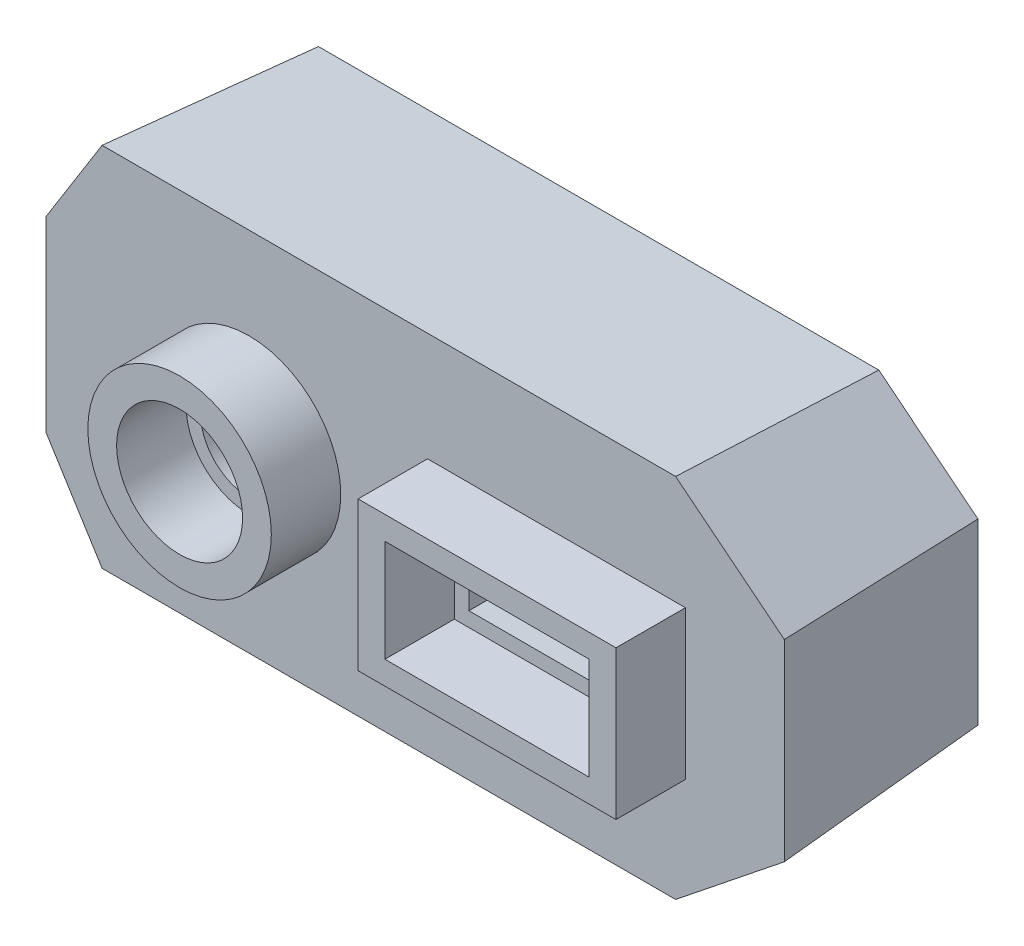
ISO-10303-21;
HEADER;
FILE_DESCRIPTION(('STEP AP214'),'2;1');
FILE_NAME('part.step','',(''),(''),'','','');
FILE_SCHEMA(('AUTOMOTIVE_DESIGN { 1 0 10303 214 1 1 1 1 }'));
ENDSEC;
DATA;
#1=APPLICATION_CONTEXT('core data for automotive mechanical design processes');
#2=APPLICATION_PROTOCOL_DEFINITION('international standard','automotive_design',2000,#1);
#3=PRODUCT_CONTEXT('',#1,'mechanical');
#4=PRODUCT('Part','Part','',(#3));
#5=PRODUCT_RELATED_PRODUCT_CATEGORY('part','',(#4));
#6=PRODUCT_DEFINITION_FORMATION('','',#4);
#7=PRODUCT_DEFINITION_CONTEXT('part definition',#1,'design');
#8=PRODUCT_DEFINITION('design','',#6,#7);
#9=PRODUCT_DEFINITION_SHAPE('','',#8);
#10=(LENGTH_UNIT() NAMED_UNIT(*) SI_UNIT(.MILLI.,.METRE.));
#11=(NAMED_UNIT(*) PLANE_ANGLE_UNIT() SI_UNIT($,.RADIAN.));
#12=(NAMED_UNIT(*) SI_UNIT($,.STERADIAN.) SOLID_ANGLE_UNIT());
#13=UNCERTAINTY_MEASURE_WITH_UNIT(LENGTH_MEASURE(1.E-05),#10,'distance_accuracy_value','');
#14=(GEOMETRIC_REPRESENTATION_CONTEXT(3) GLOBAL_UNCERTAINTY_ASSIGNED_CONTEXT((#13)) GLOBAL_UNIT_ASSIGNED_CONTEXT((#10,
#11,#12)) REPRESENTATION_CONTEXT('',''));
#15=CARTESIAN_POINT('',(0.,0.,0.));
#16=DIRECTION('',(0.,0.,1.));
#17=DIRECTION('',(1.,0.,0.));
#18=AXIS2_PLACEMENT_3D('',#15,#16,#17);
#19=CARTESIAN_POINT('',(0.,0.,42.));
#20=DIRECTION('',(0.,0.,-1.));
#21=DIRECTION('',(-1.,0.,0.));
#22=AXIS2_PLACEMENT_3D('',#19,#20,#21);
#23=PLANE('',#22);
#24=DIRECTION('',(0.52999894000318,0.847998304005088,0.));
#25=VECTOR('',#24,1.);
#26=CARTESIAN_POINT('',(-37.906238690247,23.6913991814044,42.));
#27=LINE('',#26,#25);
#28=CARTESIAN_POINT('',(-29.6277843651076,36.9369261016274,42.));
#29=VERTEX_POINT('',#28);
#30=CARTESIAN_POINT('',(-40.9369261016274,18.8422993231957,42.));
#31=VERTEX_POINT('',#30);
#32=EDGE_CURVE('E265',#29,#31,#27,.F.);
#33=ORIENTED_EDGE('',*,*,#32,.T.);
#34=DIRECTION('',(0.,1.,0.));
#35=VECTOR('',#34,1.);
#36=CARTESIAN_POINT('',(-40.9369261016274,0.,42.));
#37=LINE('',#36,#35);
#38=CARTESIAN_POINT('',(-40.9369261016274,-18.8422993231957,42.));
#39=VERTEX_POINT('',#38);
#40=EDGE_CURVE('E289',#31,#39,#37,.F.);
#41=ORIENTED_EDGE('',*,*,#40,.T.);
#42=DIRECTION('',(-0.52999894000318,0.847998304005088,0.));
#43=VECTOR('',#42,1.);
#44=CARTESIAN_POINT('',(-37.906238690247,-23.6913991814044,42.));
#45=LINE('',#44,#43);
#46=CARTESIAN_POINT('',(-29.6277843651076,-36.9369261016274,42.));
#47=VERTEX_POINT('',#46);
#48=EDGE_CURVE('E292',#39,#47,#45,.F.);
#49=ORIENTED_EDGE('',*,*,#48,.T.);
#50=DIRECTION('',(-1.,0.,0.));
#51=VECTOR('',#50,1.);
#52=CARTESIAN_POINT('',(0.,-36.9369261016274,42.));
#53=LINE('',#52,#51);
#54=CARTESIAN_POINT('',(86.0302180491857,-36.9369261016274,42.));
#55=VERTEX_POINT('',#54);
#56=EDGE_CURVE('E291',#47,#55,#53,.F.);
#57=ORIENTED_EDGE('',*,*,#56,.T.);
#58=DIRECTION('',(-0.78086880944303,-0.624695047554425,0.));
#59=VECTOR('',#58,1.);
#60=CARTESIAN_POINT('',(51.5907807516956,-64.4884759396195,42.));
#61=LINE('',#60,#59);
#62=CARTESIAN_POINT('',(107.936926101627,-19.411559659674,42.));
#63=VERTEX_POINT('',#62);
#64=EDGE_CURVE('E293',#55,#63,#61,.F.);
#65=ORIENTED_EDGE('',*,*,#64,.T.);
#66=DIRECTION('',(0.,-1.,0.));
#67=VECTOR('',#66,1.);
#68=CARTESIAN_POINT('',(107.936926101627,0.,42.));
#69=LINE('',#68,#67);
#70=CARTESIAN_POINT('',(107.936926101627,19.411559659674,42.));
#71=VERTEX_POINT('',#70);
#72=EDGE_CURVE('E300',#63,#71,#69,.F.);
#73=ORIENTED_EDGE('',*,*,#72,.T.);
#74=DIRECTION('',(0.78086880944303,-0.624695047554425,0.));
#75=VECTOR('',#74,1.);
#76=CARTESIAN_POINT('',(51.5907807516956,64.4884759396195,42.));
#77=LINE('',#76,#75);
#78=CARTESIAN_POINT('',(86.0302180491857,36.9369261016274,42.));
#79=VERTEX_POINT('',#78);
#80=EDGE_CURVE('E299',#71,#79,#77,.F.);
#81=ORIENTED_EDGE('',*,*,#80,.T.);
#82=DIRECTION('',(1.,0.,0.));
#83=VECTOR('',#82,1.);
#84=CARTESIAN_POINT('',(0.,36.9369261016274,42.));
#85=LINE('',#84,#83);
#86=EDGE_CURVE('E269',#79,#29,#85,.F.);
#87=ORIENTED_EDGE('',*,*,#86,.T.);
#88=EDGE_LOOP('',(#33,#41,#49,#57,#65,#73,#81,#87));
#89=FACE_BOUND('',#88,.T.);
#90=DIRECTION('',(0.,-1.,0.));
#91=VECTOR('',#90,1.);
#92=CARTESIAN_POINT('',(36.,0.,42.));
#93=LINE('',#92,#91);
#94=CARTESIAN_POINT('',(36.,15.,42.));
#95=VERTEX_POINT('',#94);
#96=CARTESIAN_POINT('',(36.,-15.,42.));
#97=VERTEX_POINT('',#96);
#98=EDGE_CURVE('E226',#95,#97,#93,.T.);
#99=ORIENTED_EDGE('',*,*,#98,.F.);
#100=DIRECTION('',(-1.,0.,0.));
#101=VECTOR('',#100,1.);
#102=CARTESIAN_POINT('',(0.,15.,42.));
#103=LINE('',#102,#101);
#104=CARTESIAN_POINT('',(88.,15.,42.));
#105=VERTEX_POINT('',#104);
#106=EDGE_CURVE('E221',#105,#95,#103,.T.);
#107=ORIENTED_EDGE('',*,*,#106,.F.);
#108=DIRECTION('',(0.,1.,0.));
#109=VECTOR('',#108,1.);
#110=CARTESIAN_POINT('',(88.,0.,42.));
#111=LINE('',#110,#109);
#112=CARTESIAN_POINT('',(88.,-15.,42.));
#113=VERTEX_POINT('',#112);
#114=EDGE_CURVE('E63',#113,#105,#111,.T.);
#115=ORIENTED_EDGE('',*,*,#114,.F.);
#116=DIRECTION('',(1.,0.,0.));
#117=VECTOR('',#116,1.);
#118=CARTESIAN_POINT('',(0.,-15.,42.));
#119=LINE('',#118,#117);
#120=EDGE_CURVE('E59',#97,#113,#119,.T.);
#121=ORIENTED_EDGE('',*,*,#120,.F.);
#122=EDGE_LOOP('',(#99,#107,#115,#121));
#123=FACE_BOUND('',#122,.T.);
#124=CARTESIAN_POINT('',(0.,0.,42.));
#125=DIRECTION('',(0.,0.,-1.));
#126=DIRECTION('',(-1.,0.,0.));
#127=AXIS2_PLACEMENT_3D('',#124,#125,#126);
#128=CIRCLE('',#127,18.5);
#129=CARTESIAN_POINT('',(-18.5,0.,42.));
#130=VERTEX_POINT('',#129);
#131=EDGE_CURVE('E11',#130,#130,#128,.F.);
#132=ORIENTED_EDGE('',*,*,#131,.F.);
#133=EDGE_LOOP('',(#132));
#134=FACE_BOUND('',#133,.T.);
#135=ADVANCED_FACE('F41',(#89,#123,#134),#23,.F.);
#136=CARTESIAN_POINT('',(0.,0.,42.));
#137=DIRECTION('',(0.,0.,-1.));
#138=DIRECTION('',(-1.,0.,0.));
#139=AXIS2_PLACEMENT_3D('',#136,#137,#138);
#140=CIRCLE('',#139,12.7);
#141=CARTESIAN_POINT('',(-12.7,0.,42.));
#142=VERTEX_POINT('',#141);
#143=EDGE_CURVE('E216',#142,#142,#140,.F.);
#144=ORIENTED_EDGE('',*,*,#143,.T.);
#145=EDGE_LOOP('',(#144));
#146=FACE_BOUND('',#145,.T.);
#147=CARTESIAN_POINT('',(0.,0.,42.));
#148=DIRECTION('',(0.,0.,-1.));
#149=DIRECTION('',(-1.,0.,0.));
#150=AXIS2_PLACEMENT_3D('',#147,#148,#149);
#151=CIRCLE('',#150,9.76307389837256);
#152=CARTESIAN_POINT('',(-9.76307389837256,0.,42.));
#153=VERTEX_POINT('',#152);
#154=EDGE_CURVE('E44',#153,#153,#151,.F.);
#155=ORIENTED_EDGE('',*,*,#154,.F.);
#156=EDGE_LOOP('',(#155));
#157=FACE_BOUND('',#156,.T.);
#158=ADVANCED_FACE('F353',(#146,#157),#23,.F.);
#159=DIRECTION('',(-1.,0.,0.));
#160=VECTOR('',#159,1.);
#161=CARTESIAN_POINT('',(0.,10.3,42.));
#162=LINE('',#161,#160);
#163=CARTESIAN_POINT('',(82.6,10.3,42.));
#164=VERTEX_POINT('',#163);
#165=CARTESIAN_POINT('',(41.4,10.3,42.));
#166=VERTEX_POINT('',#165);
#167=EDGE_CURVE('E182',#164,#166,#162,.T.);
#168=ORIENTED_EDGE('',*,*,#167,.T.);
#169=DIRECTION('',(0.,-1.,0.));
#170=VECTOR('',#169,1.);
#171=CARTESIAN_POINT('',(41.4,0.,42.));
#172=LINE('',#171,#170);
#173=CARTESIAN_POINT('',(41.4,-10.3,42.));
#174=VERTEX_POINT('',#173);
#175=EDGE_CURVE('E206',#166,#174,#172,.T.);
#176=ORIENTED_EDGE('',*,*,#175,.T.);
#177=DIRECTION('',(1.,0.,0.));
#178=VECTOR('',#177,1.);
#179=CARTESIAN_POINT('',(0.,-10.3,42.));
#180=LINE('',#179,#178);
#181=CARTESIAN_POINT('',(82.6,-10.3,42.));
#182=VERTEX_POINT('',#181);
#183=EDGE_CURVE('E214',#174,#182,#180,.T.);
#184=ORIENTED_EDGE('',*,*,#183,.T.);
#185=DIRECTION('',(0.,1.,0.));
#186=VECTOR('',#185,1.);
#187=CARTESIAN_POINT('',(82.6,0.,42.));
#188=LINE('',#187,#186);
#189=EDGE_CURVE('E208',#182,#164,#188,.T.);
#190=ORIENTED_EDGE('',*,*,#189,.T.);
#191=EDGE_LOOP('',(#168,#176,#184,#190));
#192=FACE_BOUND('',#191,.T.);
#193=DIRECTION('',(0.,-1.,0.));
#194=VECTOR('',#193,1.);
#195=CARTESIAN_POINT('',(44.3369261016274,0.,42.));
#196=LINE('',#195,#194);
#197=CARTESIAN_POINT('',(44.3369261016274,7.36307389837256,42.));
#198=VERTEX_POINT('',#197);
#199=CARTESIAN_POINT('',(44.3369261016274,-7.36307389837256,42.));
#200=VERTEX_POINT('',#199);
#201=EDGE_CURVE('E238',#198,#200,#196,.T.);
#202=ORIENTED_EDGE('',*,*,#201,.F.);
#203=DIRECTION('',(-1.,0.,0.));
#204=VECTOR('',#203,1.);
#205=CARTESIAN_POINT('',(0.,7.36307389837256,42.));
#206=LINE('',#205,#204);
#207=CARTESIAN_POINT('',(79.6630738983726,7.36307389837256,42.));
#208=VERTEX_POINT('',#207);
#209=EDGE_CURVE('E306',#208,#198,#206,.T.);
#210=ORIENTED_EDGE('',*,*,#209,.F.);
#211=DIRECTION('',(0.,1.,0.));
#212=VECTOR('',#211,1.);
#213=CARTESIAN_POINT('',(79.6630738983726,0.,42.));
#214=LINE('',#213,#212);
#215=CARTESIAN_POINT('',(79.6630738983726,-7.36307389837256,42.));
#216=VERTEX_POINT('',#215);
#217=EDGE_CURVE('E313',#216,#208,#214,.T.);
#218=ORIENTED_EDGE('',*,*,#217,.F.);
#219=DIRECTION('',(1.,0.,0.));
#220=VECTOR('',#219,1.);
#221=CARTESIAN_POINT('',(0.,-7.36307389837256,42.));
#222=LINE('',#221,#220);
#223=EDGE_CURVE('E316',#200,#216,#222,.T.);
#224=ORIENTED_EDGE('',*,*,#223,.F.);
#225=EDGE_LOOP('',(#202,#210,#218,#224));
#226=FACE_BOUND('',#225,.T.);
#227=ADVANCED_FACE('F326',(#192,#226),#23,.F.);
#228=CARTESIAN_POINT('',(0.,0.,0.));
#229=DIRECTION('',(0.,0.,-1.));
#230=DIRECTION('',(-1.,0.,0.));
#231=AXIS2_PLACEMENT_3D('',#228,#229,#230);
#232=PLANE('',#231);
#233=DIRECTION('',(-1.,0.,0.));
#234=VECTOR('',#233,1.);
#235=CARTESIAN_POINT('',(41.4,10.3,0.));
#236=LINE('',#235,#234);
#237=CARTESIAN_POINT('',(82.6,10.3,0.));
#238=VERTEX_POINT('',#237);
#239=CARTESIAN_POINT('',(41.4,10.3,0.));
#240=VERTEX_POINT('',#239);
#241=EDGE_CURVE('E240',#238,#240,#236,.T.);
#242=ORIENTED_EDGE('',*,*,#241,.T.);
#243=DIRECTION('',(0.,-1.,0.));
#244=VECTOR('',#243,1.);
#245=CARTESIAN_POINT('',(41.4,-10.3,0.));
#246=LINE('',#245,#244);
#247=CARTESIAN_POINT('',(41.4,-10.3,0.));
#248=VERTEX_POINT('',#247);
#249=EDGE_CURVE('E230',#240,#248,#246,.T.);
#250=ORIENTED_EDGE('',*,*,#249,.T.);
#251=DIRECTION('',(1.,0.,0.));
#252=VECTOR('',#251,1.);
#253=CARTESIAN_POINT('',(41.4,-10.3,0.));
#254=LINE('',#253,#252);
#255=CARTESIAN_POINT('',(82.6,-10.3,0.));
#256=VERTEX_POINT('',#255);
#257=EDGE_CURVE('E231',#248,#256,#254,.T.);
#258=ORIENTED_EDGE('',*,*,#257,.T.);
#259=DIRECTION('',(0.,1.,0.));
#260=VECTOR('',#259,1.);
#261=CARTESIAN_POINT('',(82.6,-10.3,0.));
#262=LINE('',#261,#260);
#263=EDGE_CURVE('E233',#256,#238,#262,.T.);
#264=ORIENTED_EDGE('',*,*,#263,.T.);
#265=EDGE_LOOP('',(#242,#250,#258,#264));
#266=FACE_BOUND('',#265,.T.);
#267=DIRECTION('',(-0.52999894000318,-0.847998304005088,0.));
#268=VECTOR('',#267,1.);
#269=CARTESIAN_POINT('',(-38.,18.,0.));
#270=LINE('',#269,#268);
#271=CARTESIAN_POINT('',(-28.,34.,0.));
#272=VERTEX_POINT('',#271);
#273=CARTESIAN_POINT('',(-38.,18.,0.));
#274=VERTEX_POINT('',#273);
#275=EDGE_CURVE('E241',#272,#274,#270,.T.);
#276=ORIENTED_EDGE('',*,*,#275,.F.);
#277=DIRECTION('',(-1.,0.,0.));
#278=VECTOR('',#277,1.);
#279=CARTESIAN_POINT('',(-28.,34.,0.));
#280=LINE('',#279,#278);
#281=CARTESIAN_POINT('',(85.,34.,0.));
#282=VERTEX_POINT('',#281);
#283=EDGE_CURVE('E259',#282,#272,#280,.T.);
#284=ORIENTED_EDGE('',*,*,#283,.F.);
#285=DIRECTION('',(-0.78086880944303,0.624695047554425,0.));
#286=VECTOR('',#285,1.);
#287=CARTESIAN_POINT('',(85.,34.,0.));
#288=LINE('',#287,#286);
#289=CARTESIAN_POINT('',(105.,18.,0.));
#290=VERTEX_POINT('',#289);
#291=EDGE_CURVE('E256',#290,#282,#288,.T.);
#292=ORIENTED_EDGE('',*,*,#291,.F.);
#293=DIRECTION('',(0.,1.,0.));
#294=VECTOR('',#293,1.);
#295=CARTESIAN_POINT('',(105.,18.,0.));
#296=LINE('',#295,#294);
#297=CARTESIAN_POINT('',(105.,-18.,0.));
#298=VERTEX_POINT('',#297);
#299=EDGE_CURVE('E258',#298,#290,#296,.T.);
#300=ORIENTED_EDGE('',*,*,#299,.F.);
#301=DIRECTION('',(0.78086880944303,0.624695047554425,0.));
#302=VECTOR('',#301,1.);
#303=CARTESIAN_POINT('',(105.,-18.,0.));
#304=LINE('',#303,#302);
#305=CARTESIAN_POINT('',(85.,-34.,0.));
#306=VERTEX_POINT('',#305);
#307=EDGE_CURVE('E254',#306,#298,#304,.T.);
#308=ORIENTED_EDGE('',*,*,#307,.F.);
#309=DIRECTION('',(1.,0.,0.));
#310=VECTOR('',#309,1.);
#311=CARTESIAN_POINT('',(85.,-34.,0.));
#312=LINE('',#311,#310);
#313=CARTESIAN_POINT('',(-28.,-34.,0.));
#314=VERTEX_POINT('',#313);
#315=EDGE_CURVE('E255',#314,#306,#312,.T.);
#316=ORIENTED_EDGE('',*,*,#315,.F.);
#317=DIRECTION('',(0.52999894000318,-0.847998304005088,0.));
#318=VECTOR('',#317,1.);
#319=CARTESIAN_POINT('',(-28.,-34.,0.));
#320=LINE('',#319,#318);
#321=CARTESIAN_POINT('',(-38.,-18.,0.));
#322=VERTEX_POINT('',#321);
#323=EDGE_CURVE('E248',#322,#314,#320,.T.);
#324=ORIENTED_EDGE('',*,*,#323,.F.);
#325=DIRECTION('',(0.,-1.,0.));
#326=VECTOR('',#325,1.);
#327=CARTESIAN_POINT('',(-38.,-18.,0.));
#328=LINE('',#327,#326);
#329=EDGE_CURVE('E246',#274,#322,#328,.T.);
#330=ORIENTED_EDGE('',*,*,#329,.F.);
#331=EDGE_LOOP('',(#276,#284,#292,#300,#308,#316,#324,#330));
#332=FACE_BOUND('',#331,.T.);
#333=CARTESIAN_POINT('',(0.,0.,0.));
#334=DIRECTION('',(0.,0.,1.));
#335=DIRECTION('',(1.,0.,0.));
#336=AXIS2_PLACEMENT_3D('',#333,#334,#335);
#337=CIRCLE('',#336,12.7);
#338=CARTESIAN_POINT('',(12.7,0.,0.));
#339=VERTEX_POINT('',#338);
#340=EDGE_CURVE('E242',#339,#339,#337,.T.);
#341=ORIENTED_EDGE('',*,*,#340,.T.);
#342=EDGE_LOOP('',(#341));
#343=FACE_BOUND('',#342,.T.);
#344=ADVANCED_FACE('F334',(#266,#332,#343),#232,.T.);
#345=CARTESIAN_POINT('',(-38.,18.,0.));
#346=DIRECTION('',(-0.845932622756777,0.528707889222986,-0.0697564737441253));
#347=DIRECTION('',(0.0591533714283937,-0.0369708571427461,-0.997564050259824));
#348=AXIS2_PLACEMENT_3D('',#345,#346,#347);
#349=PLANE('',#348);
#350=ORIENTED_EDGE('',*,*,#275,.T.);
#351=DIRECTION('',(0.0697425184149833,-0.0200018911018393,-0.997364479755263));
#352=VECTOR('',#351,1.);
#353=CARTESIAN_POINT('',(-37.9497806386938,17.9855972766846,-0.718170325664664));
#354=LINE('',#353,#352);
#355=EDGE_CURVE('E49',#31,#274,#354,.T.);
#356=ORIENTED_EDGE('',*,*,#355,.F.);
#357=ORIENTED_EDGE('',*,*,#32,.F.);
#358=DIRECTION('',(0.0386334975803705,-0.0697043968925528,-0.996819316585786));
#359=VECTOR('',#358,1.);
#360=CARTESIAN_POINT('',(-27.9718386769739,33.9491899993484,-0.726616861821506));
#361=LINE('',#360,#359);
#362=EDGE_CURVE('E266',#29,#272,#361,.T.);
#363=ORIENTED_EDGE('',*,*,#362,.T.);
#364=EDGE_LOOP('',(#350,#356,#357,#363));
#365=FACE_BOUND('',#364,.T.);
#366=ADVANCED_FACE('F364',(#365),#349,.T.);
#367=CARTESIAN_POINT('',(-38.,-18.,0.));
#368=DIRECTION('',(-0.997564050259824,0.,-0.0697564737441253));
#369=DIRECTION('',(0.0697564737441253,0.,-0.997564050259824));
#370=AXIS2_PLACEMENT_3D('',#367,#368,#369);
#371=PLANE('',#370);
#372=ORIENTED_EDGE('',*,*,#329,.T.);
#373=DIRECTION('',(0.0697425184149834,0.0200018911018393,-0.997364479755263));
#374=VECTOR('',#373,1.);
#375=CARTESIAN_POINT('',(-37.9736795273874,-17.9924513877774,-0.376400294551299));
#376=LINE('',#375,#374);
#377=EDGE_CURVE('E262',#39,#322,#376,.T.);
#378=ORIENTED_EDGE('',*,*,#377,.F.);
#379=ORIENTED_EDGE('',*,*,#40,.F.);
#380=ORIENTED_EDGE('',*,*,#355,.T.);
#381=EDGE_LOOP('',(#372,#378,#379,#380));
#382=FACE_BOUND('',#381,.T.);
#383=ADVANCED_FACE('F593',(#382),#371,.T.);
#384=CARTESIAN_POINT('',(-28.,-34.,0.));
#385=DIRECTION('',(-0.845932622756777,-0.528707889222986,-0.0697564737441253));
#386=DIRECTION('',(0.0591533714283937,0.0369708571427461,-0.997564050259824));
#387=AXIS2_PLACEMENT_3D('',#384,#385,#386);
#388=PLANE('',#387);
#389=ORIENTED_EDGE('',*,*,#323,.T.);
#390=DIRECTION('',(0.0386334975803705,0.0697043968925528,-0.996819316585786));
#391=VECTOR('',#390,1.);
#392=CARTESIAN_POINT('',(-27.8313421737119,-33.6956995146981,-4.35169968205834));
#393=LINE('',#392,#391);
#394=EDGE_CURVE('E285',#47,#314,#393,.T.);
#395=ORIENTED_EDGE('',*,*,#394,.F.);
#396=ORIENTED_EDGE('',*,*,#48,.F.);
#397=ORIENTED_EDGE('',*,*,#377,.T.);
#398=EDGE_LOOP('',(#389,#395,#396,#397));
#399=FACE_BOUND('',#398,.T.);
#400=ADVANCED_FACE('F584',(#399),#388,.T.);
#401=CARTESIAN_POINT('',(85.,-34.,0.));
#402=DIRECTION('',(0.,-0.997564050259824,-0.0697564737441253));
#403=DIRECTION('',(0.,0.0697564737441253,-0.997564050259824));
#404=AXIS2_PLACEMENT_3D('',#401,#402,#403);
#405=PLANE('',#404);
#406=ORIENTED_EDGE('',*,*,#315,.T.);
#407=DIRECTION('',(-0.0244619276344669,0.0697355999757294,-0.997265541464474));
#408=VECTOR('',#407,1.);
#409=CARTESIAN_POINT('',(84.9846738428695,-33.9563084815395,-0.624817823753304));
#410=LINE('',#409,#408);
#411=EDGE_CURVE('E278',#55,#306,#410,.T.);
#412=ORIENTED_EDGE('',*,*,#411,.F.);
#413=ORIENTED_EDGE('',*,*,#56,.F.);
#414=ORIENTED_EDGE('',*,*,#394,.T.);
#415=EDGE_LOOP('',(#406,#412,#413,#414));
#416=FACE_BOUND('',#415,.T.);
#417=ADVANCED_FACE('F578',(#416),#405,.T.);
#418=CARTESIAN_POINT('',(105.,-18.,0.));
#419=DIRECTION('',(0.623173321815645,-0.778966652269556,-0.0697564737441253));
#420=DIRECTION('',(-0.0435765236828153,0.0544706546035191,-0.997564050259824));
#421=AXIS2_PLACEMENT_3D('',#418,#419,#420);
#422=PLANE('',#421);
#423=ORIENTED_EDGE('',*,*,#307,.T.);
#424=DIRECTION('',(-0.0697173022566143,0.0335078677642604,-0.997003871890151));
#425=VECTOR('',#424,1.);
#426=CARTESIAN_POINT('',(104.915901186784,-17.9595800207241,-1.20266906039103));
#427=LINE('',#426,#425);
#428=EDGE_CURVE('E276',#63,#298,#427,.T.);
#429=ORIENTED_EDGE('',*,*,#428,.F.);
#430=ORIENTED_EDGE('',*,*,#64,.F.);
#431=ORIENTED_EDGE('',*,*,#411,.T.);
#432=EDGE_LOOP('',(#423,#429,#430,#431));
#433=FACE_BOUND('',#432,.T.);
#434=ADVANCED_FACE('F570',(#433),#422,.T.);
#435=CARTESIAN_POINT('',(105.,18.,0.));
#436=DIRECTION('',(0.997564050259824,0.,-0.0697564737441253));
#437=DIRECTION('',(-0.0697564737441253,0.,-0.997564050259824));
#438=AXIS2_PLACEMENT_3D('',#435,#436,#437);
#439=PLANE('',#438);
#440=ORIENTED_EDGE('',*,*,#299,.T.);
#441=DIRECTION('',(-0.0697173022566143,-0.0335078677642604,-0.997003871890151));
#442=VECTOR('',#441,1.);
#443=CARTESIAN_POINT('',(104.94016720564,17.9712428723358,-0.855648823355596));
#444=LINE('',#443,#442);
#445=EDGE_CURVE('E273',#71,#290,#444,.T.);
#446=ORIENTED_EDGE('',*,*,#445,.F.);
#447=ORIENTED_EDGE('',*,*,#72,.F.);
#448=ORIENTED_EDGE('',*,*,#428,.T.);
#449=EDGE_LOOP('',(#440,#446,#447,#448));
#450=FACE_BOUND('',#449,.T.);
#451=ADVANCED_FACE('F558',(#450),#439,.T.);
#452=CARTESIAN_POINT('',(85.,34.,0.));
#453=DIRECTION('',(0.623173321815645,0.778966652269556,-0.0697564737441253));
#454=DIRECTION('',(-0.0435765236828153,-0.0544706546035191,-0.997564050259824));
#455=AXIS2_PLACEMENT_3D('',#452,#453,#454);
#456=PLANE('',#455);
#457=ORIENTED_EDGE('',*,*,#291,.T.);
#458=DIRECTION('',(-0.0244619276344669,-0.0697355999757294,-0.997265541464474));
#459=VECTOR('',#458,1.);
#460=CARTESIAN_POINT('',(84.9323823928939,33.8072370063828,-2.75663923836461));
#461=LINE('',#460,#459);
#462=EDGE_CURVE('E267',#79,#282,#461,.T.);
#463=ORIENTED_EDGE('',*,*,#462,.F.);
#464=ORIENTED_EDGE('',*,*,#80,.F.);
#465=ORIENTED_EDGE('',*,*,#445,.T.);
#466=EDGE_LOOP('',(#457,#463,#464,#465));
#467=FACE_BOUND('',#466,.T.);
#468=ADVANCED_FACE('F548',(#467),#456,.T.);
#469=CARTESIAN_POINT('',(-28.,34.,0.));
#470=DIRECTION('',(0.,0.997564050259824,-0.0697564737441253));
#471=DIRECTION('',(0.,-0.0697564737441253,-0.997564050259824));
#472=AXIS2_PLACEMENT_3D('',#469,#470,#471);
#473=PLANE('',#472);
#474=ORIENTED_EDGE('',*,*,#283,.T.);
#475=ORIENTED_EDGE('',*,*,#362,.F.);
#476=ORIENTED_EDGE('',*,*,#86,.F.);
#477=ORIENTED_EDGE('',*,*,#462,.T.);
#478=EDGE_LOOP('',(#474,#475,#476,#477));
#479=FACE_BOUND('',#478,.T.);
#480=ADVANCED_FACE('F541',(#479),#473,.T.);
#481=CARTESIAN_POINT('',(0.,0.,0.));
#482=DIRECTION('',(0.,0.,-1.));
#483=DIRECTION('',(1.,0.,0.));
#484=AXIS2_PLACEMENT_3D('',#481,#482,#483);
#485=CONICAL_SURFACE('',#484,12.7,0.0698131700797732);
#486=ORIENTED_EDGE('',*,*,#154,.T.);
#487=EDGE_LOOP('',(#486));
#488=FACE_BOUND('',#487,.T.);
#489=ORIENTED_EDGE('',*,*,#340,.F.);
#490=EDGE_LOOP('',(#489));
#491=FACE_BOUND('',#490,.T.);
#492=ADVANCED_FACE('F534',(#488,#491),#485,.F.);
#493=CARTESIAN_POINT('',(41.4,-10.3,0.));
#494=DIRECTION('',(0.997564050259824,0.,-0.0697564737441253));
#495=DIRECTION('',(-0.0697564737441253,0.,-0.997564050259824));
#496=AXIS2_PLACEMENT_3D('',#493,#494,#495);
#497=PLANE('',#496);
#498=ORIENTED_EDGE('',*,*,#249,.F.);
#499=DIRECTION('',(-0.0695873743166647,0.0695873743166647,-0.995145815783509));
#500=VECTOR('',#499,1.);
#501=CARTESIAN_POINT('',(41.4997534948843,10.2002465051157,1.42654143828135));
#502=LINE('',#501,#500);
#503=EDGE_CURVE('E304',#198,#240,#502,.T.);
#504=ORIENTED_EDGE('',*,*,#503,.F.);
#505=ORIENTED_EDGE('',*,*,#201,.T.);
#506=DIRECTION('',(-0.0695873743166647,-0.0695873743166647,-0.995145815783509));
#507=VECTOR('',#506,1.);
#508=CARTESIAN_POINT('',(41.4,-10.3,0.));
#509=LINE('',#508,#507);
#510=EDGE_CURVE('E244',#200,#248,#509,.T.);
#511=ORIENTED_EDGE('',*,*,#510,.T.);
#512=EDGE_LOOP('',(#498,#504,#505,#511));
#513=FACE_BOUND('',#512,.T.);
#514=ADVANCED_FACE('F321',(#513),#497,.T.);
#515=CARTESIAN_POINT('',(41.4,-10.3,0.));
#516=DIRECTION('',(0.,0.997564050259824,-0.0697564737441253));
#517=DIRECTION('',(0.,-0.0697564737441253,-0.997564050259824));
#518=AXIS2_PLACEMENT_3D('',#515,#516,#517);
#519=PLANE('',#518);
#520=ORIENTED_EDGE('',*,*,#257,.F.);
#521=ORIENTED_EDGE('',*,*,#510,.F.);
#522=ORIENTED_EDGE('',*,*,#223,.T.);
#523=DIRECTION('',(0.0695873743166647,-0.0695873743166647,-0.995145815783509));
#524=VECTOR('',#523,1.);
#525=CARTESIAN_POINT('',(82.6,-10.3,0.));
#526=LINE('',#525,#524);
#527=EDGE_CURVE('E305',#216,#256,#526,.T.);
#528=ORIENTED_EDGE('',*,*,#527,.T.);
#529=EDGE_LOOP('',(#520,#521,#522,#528));
#530=FACE_BOUND('',#529,.T.);
#531=ADVANCED_FACE('F327',(#530),#519,.T.);
#532=CARTESIAN_POINT('',(82.6,-10.3,0.));
#533=DIRECTION('',(-0.997564050259824,0.,-0.0697564737441253));
#534=DIRECTION('',(0.0697564737441253,0.,-0.997564050259824));
#535=AXIS2_PLACEMENT_3D('',#532,#533,#534);
#536=PLANE('',#535);
#537=ORIENTED_EDGE('',*,*,#263,.F.);
#538=ORIENTED_EDGE('',*,*,#527,.F.);
#539=ORIENTED_EDGE('',*,*,#217,.T.);
#540=DIRECTION('',(0.0695873743166647,0.0695873743166647,-0.995145815783509));
#541=VECTOR('',#540,1.);
#542=CARTESIAN_POINT('',(82.4004930102314,10.1004930102314,2.85308287656269));
#543=LINE('',#542,#541);
#544=EDGE_CURVE('E302',#208,#238,#543,.T.);
#545=ORIENTED_EDGE('',*,*,#544,.T.);
#546=EDGE_LOOP('',(#537,#538,#539,#545));
#547=FACE_BOUND('',#546,.T.);
#548=ADVANCED_FACE('F43',(#547),#536,.T.);
#549=CARTESIAN_POINT('',(41.4,10.3,0.));
#550=DIRECTION('',(0.,-0.997564050259824,-0.0697564737441253));
#551=DIRECTION('',(0.,0.0697564737441253,-0.997564050259824));
#552=AXIS2_PLACEMENT_3D('',#549,#550,#551);
#553=PLANE('',#552);
#554=ORIENTED_EDGE('',*,*,#241,.F.);
#555=ORIENTED_EDGE('',*,*,#544,.F.);
#556=ORIENTED_EDGE('',*,*,#209,.T.);
#557=ORIENTED_EDGE('',*,*,#503,.T.);
#558=EDGE_LOOP('',(#554,#555,#556,#557));
#559=FACE_BOUND('',#558,.T.);
#560=ADVANCED_FACE('F340',(#559),#553,.T.);
#561=CARTESIAN_POINT('',(36.,-15.,56.));
#562=DIRECTION('',(1.,0.,0.));
#563=DIRECTION('',(0.,0.,-1.));
#564=AXIS2_PLACEMENT_3D('',#561,#562,#563);
#565=PLANE('',#564);
#566=DIRECTION('',(0.,0.,-1.));
#567=VECTOR('',#566,1.);
#568=CARTESIAN_POINT('',(36.,15.,56.));
#569=LINE('',#568,#567);
#570=CARTESIAN_POINT('',(36.,15.,56.));
#571=VERTEX_POINT('',#570);
#572=EDGE_CURVE('E384',#571,#95,#569,.T.);
#573=ORIENTED_EDGE('',*,*,#572,.T.);
#574=ORIENTED_EDGE('',*,*,#98,.T.);
#575=DIRECTION('',(0.,0.,-1.));
#576=VECTOR('',#575,1.);
#577=CARTESIAN_POINT('',(36.,-15.,56.));
#578=LINE('',#577,#576);
#579=CARTESIAN_POINT('',(36.,-15.,56.));
#580=VERTEX_POINT('',#579);
#581=EDGE_CURVE('E391',#580,#97,#578,.T.);
#582=ORIENTED_EDGE('',*,*,#581,.F.);
#583=DIRECTION('',(0.,-1.,0.));
#584=VECTOR('',#583,1.);
#585=CARTESIAN_POINT('',(36.,-15.,56.));
#586=LINE('',#585,#584);
#587=EDGE_CURVE('E374',#571,#580,#586,.T.);
#588=ORIENTED_EDGE('',*,*,#587,.F.);
#589=EDGE_LOOP('',(#573,#574,#582,#588));
#590=FACE_BOUND('',#589,.T.);
#591=ADVANCED_FACE('F339',(#590),#565,.F.);
#592=CARTESIAN_POINT('',(36.,-15.,56.));
#593=DIRECTION('',(0.,1.,0.));
#594=DIRECTION('',(0.,0.,1.));
#595=AXIS2_PLACEMENT_3D('',#592,#593,#594);
#596=PLANE('',#595);
#597=ORIENTED_EDGE('',*,*,#581,.T.);
#598=ORIENTED_EDGE('',*,*,#120,.T.);
#599=DIRECTION('',(0.,0.,-1.));
#600=VECTOR('',#599,1.);
#601=CARTESIAN_POINT('',(88.,-15.,56.));
#602=LINE('',#601,#600);
#603=CARTESIAN_POINT('',(88.,-15.,56.));
#604=VERTEX_POINT('',#603);
#605=EDGE_CURVE('E386',#604,#113,#602,.T.);
#606=ORIENTED_EDGE('',*,*,#605,.F.);
#607=DIRECTION('',(1.,0.,0.));
#608=VECTOR('',#607,1.);
#609=CARTESIAN_POINT('',(36.,-15.,56.));
#610=LINE('',#609,#608);
#611=EDGE_CURVE('E378',#580,#604,#610,.T.);
#612=ORIENTED_EDGE('',*,*,#611,.F.);
#613=EDGE_LOOP('',(#597,#598,#606,#612));
#614=FACE_BOUND('',#613,.T.);
#615=ADVANCED_FACE('F348',(#614),#596,.F.);
#616=CARTESIAN_POINT('',(88.,-15.,56.));
#617=DIRECTION('',(-1.,0.,0.));
#618=DIRECTION('',(0.,0.,1.));
#619=AXIS2_PLACEMENT_3D('',#616,#617,#618);
#620=PLANE('',#619);
#621=ORIENTED_EDGE('',*,*,#605,.T.);
#622=ORIENTED_EDGE('',*,*,#114,.T.);
#623=DIRECTION('',(0.,0.,-1.));
#624=VECTOR('',#623,1.);
#625=CARTESIAN_POINT('',(88.,15.,56.));
#626=LINE('',#625,#624);
#627=CARTESIAN_POINT('',(88.,15.,56.));
#628=VERTEX_POINT('',#627);
#629=EDGE_CURVE('E390',#628,#105,#626,.T.);
#630=ORIENTED_EDGE('',*,*,#629,.F.);
#631=DIRECTION('',(0.,1.,0.));
#632=VECTOR('',#631,1.);
#633=CARTESIAN_POINT('',(88.,-15.,56.));
#634=LINE('',#633,#632);
#635=EDGE_CURVE('E376',#604,#628,#634,.T.);
#636=ORIENTED_EDGE('',*,*,#635,.F.);
#637=EDGE_LOOP('',(#621,#622,#630,#636));
#638=FACE_BOUND('',#637,.T.);
#639=ADVANCED_FACE('F416',(#638),#620,.F.);
#640=CARTESIAN_POINT('',(36.,15.,56.));
#641=DIRECTION('',(0.,-1.,0.));
#642=DIRECTION('',(0.,0.,-1.));
#643=AXIS2_PLACEMENT_3D('',#640,#641,#642);
#644=PLANE('',#643);
#645=ORIENTED_EDGE('',*,*,#629,.T.);
#646=ORIENTED_EDGE('',*,*,#106,.T.);
#647=ORIENTED_EDGE('',*,*,#572,.F.);
#648=DIRECTION('',(-1.,0.,0.));
#649=VECTOR('',#648,1.);
#650=CARTESIAN_POINT('',(36.,15.,56.));
#651=LINE('',#650,#649);
#652=EDGE_CURVE('E385',#628,#571,#651,.T.);
#653=ORIENTED_EDGE('',*,*,#652,.F.);
#654=EDGE_LOOP('',(#645,#646,#647,#653));
#655=FACE_BOUND('',#654,.T.);
#656=ADVANCED_FACE('F423',(#655),#644,.F.);
#657=CARTESIAN_POINT('',(41.4,-10.3,56.));
#658=DIRECTION('',(0.,1.,0.));
#659=DIRECTION('',(0.,0.,1.));
#660=AXIS2_PLACEMENT_3D('',#657,#658,#659);
#661=PLANE('',#660);
#662=ORIENTED_EDGE('',*,*,#183,.F.);
#663=DIRECTION('',(0.,0.,-1.));
#664=VECTOR('',#663,1.);
#665=CARTESIAN_POINT('',(41.4,-10.3,56.));
#666=LINE('',#665,#664);
#667=CARTESIAN_POINT('',(41.4,-10.3,56.));
#668=VERTEX_POINT('',#667);
#669=EDGE_CURVE('E372',#668,#174,#666,.T.);
#670=ORIENTED_EDGE('',*,*,#669,.F.);
#671=DIRECTION('',(1.,0.,0.));
#672=VECTOR('',#671,1.);
#673=CARTESIAN_POINT('',(41.4,-10.3,56.));
#674=LINE('',#673,#672);
#675=CARTESIAN_POINT('',(82.6,-10.3,56.));
#676=VERTEX_POINT('',#675);
#677=EDGE_CURVE('E200',#668,#676,#674,.T.);
#678=ORIENTED_EDGE('',*,*,#677,.T.);
#679=DIRECTION('',(0.,0.,-1.));
#680=VECTOR('',#679,1.);
#681=CARTESIAN_POINT('',(82.6,-10.3,56.));
#682=LINE('',#681,#680);
#683=EDGE_CURVE('E187',#676,#182,#682,.T.);
#684=ORIENTED_EDGE('',*,*,#683,.T.);
#685=EDGE_LOOP('',(#662,#670,#678,#684));
#686=FACE_BOUND('',#685,.T.);
#687=ADVANCED_FACE('F367',(#686),#661,.T.);
#688=CARTESIAN_POINT('',(41.4,10.3,56.));
#689=DIRECTION('',(0.,-1.,0.));
#690=DIRECTION('',(0.,0.,-1.));
#691=AXIS2_PLACEMENT_3D('',#688,#689,#690);
#692=PLANE('',#691);
#693=ORIENTED_EDGE('',*,*,#167,.F.);
#694=DIRECTION('',(0.,0.,-1.));
#695=VECTOR('',#694,1.);
#696=CARTESIAN_POINT('',(82.6,10.3,56.));
#697=LINE('',#696,#695);
#698=CARTESIAN_POINT('',(82.6,10.3,56.));
#699=VERTEX_POINT('',#698);
#700=EDGE_CURVE('E180',#699,#164,#697,.T.);
#701=ORIENTED_EDGE('',*,*,#700,.F.);
#702=DIRECTION('',(-1.,0.,0.));
#703=VECTOR('',#702,1.);
#704=CARTESIAN_POINT('',(41.4,10.3,56.));
#705=LINE('',#704,#703);
#706=CARTESIAN_POINT('',(41.4,10.3,56.));
#707=VERTEX_POINT('',#706);
#708=EDGE_CURVE('E181',#699,#707,#705,.T.);
#709=ORIENTED_EDGE('',*,*,#708,.T.);
#710=DIRECTION('',(0.,0.,-1.));
#711=VECTOR('',#710,1.);
#712=CARTESIAN_POINT('',(41.4,10.3,56.));
#713=LINE('',#712,#711);
#714=EDGE_CURVE('E190',#707,#166,#713,.T.);
#715=ORIENTED_EDGE('',*,*,#714,.T.);
#716=EDGE_LOOP('',(#693,#701,#709,#715));
#717=FACE_BOUND('',#716,.T.);
#718=ADVANCED_FACE('F177',(#717),#692,.T.);
#719=CARTESIAN_POINT('',(41.4,-10.3,56.));
#720=DIRECTION('',(1.,0.,0.));
#721=DIRECTION('',(0.,0.,-1.));
#722=AXIS2_PLACEMENT_3D('',#719,#720,#721);
#723=PLANE('',#722);
#724=ORIENTED_EDGE('',*,*,#175,.F.);
#725=ORIENTED_EDGE('',*,*,#714,.F.);
#726=DIRECTION('',(0.,-1.,0.));
#727=VECTOR('',#726,1.);
#728=CARTESIAN_POINT('',(41.4,-10.3,56.));
#729=LINE('',#728,#727);
#730=EDGE_CURVE('E202',#707,#668,#729,.T.);
#731=ORIENTED_EDGE('',*,*,#730,.T.);
#732=ORIENTED_EDGE('',*,*,#669,.T.);
#733=EDGE_LOOP('',(#724,#725,#731,#732));
#734=FACE_BOUND('',#733,.T.);
#735=ADVANCED_FACE('F432',(#734),#723,.T.);
#736=CARTESIAN_POINT('',(82.6,-10.3,56.));
#737=DIRECTION('',(-1.,0.,0.));
#738=DIRECTION('',(0.,0.,1.));
#739=AXIS2_PLACEMENT_3D('',#736,#737,#738);
#740=PLANE('',#739);
#741=ORIENTED_EDGE('',*,*,#189,.F.);
#742=ORIENTED_EDGE('',*,*,#683,.F.);
#743=DIRECTION('',(0.,1.,0.));
#744=VECTOR('',#743,1.);
#745=CARTESIAN_POINT('',(82.6,-10.3,56.));
#746=LINE('',#745,#744);
#747=EDGE_CURVE('E195',#676,#699,#746,.T.);
#748=ORIENTED_EDGE('',*,*,#747,.T.);
#749=ORIENTED_EDGE('',*,*,#700,.T.);
#750=EDGE_LOOP('',(#741,#742,#748,#749));
#751=FACE_BOUND('',#750,.T.);
#752=ADVANCED_FACE('F194',(#751),#740,.T.);
#753=CARTESIAN_POINT('',(0.,0.,56.));
#754=DIRECTION('',(0.,0.,-1.));
#755=DIRECTION('',(-1.,0.,0.));
#756=AXIS2_PLACEMENT_3D('',#753,#754,#755);
#757=PLANE('',#756);
#758=ORIENTED_EDGE('',*,*,#587,.T.);
#759=ORIENTED_EDGE('',*,*,#611,.T.);
#760=ORIENTED_EDGE('',*,*,#635,.T.);
#761=ORIENTED_EDGE('',*,*,#652,.T.);
#762=EDGE_LOOP('',(#758,#759,#760,#761));
#763=FACE_BOUND('',#762,.T.);
#764=ORIENTED_EDGE('',*,*,#730,.F.);
#765=ORIENTED_EDGE('',*,*,#708,.F.);
#766=ORIENTED_EDGE('',*,*,#747,.F.);
#767=ORIENTED_EDGE('',*,*,#677,.F.);
#768=EDGE_LOOP('',(#764,#765,#766,#767));
#769=FACE_BOUND('',#768,.T.);
#770=ADVANCED_FACE('F196',(#763,#769),#757,.F.);
#771=CARTESIAN_POINT('',(0.,0.,56.));
#772=DIRECTION('',(0.,0.,-1.));
#773=DIRECTION('',(-1.,0.,0.));
#774=AXIS2_PLACEMENT_3D('',#771,#772,#773);
#775=CYLINDRICAL_SURFACE('',#774,18.5);
#776=CARTESIAN_POINT('',(0.,0.,56.));
#777=DIRECTION('',(0.,0.,1.));
#778=DIRECTION('',(1.,0.,0.));
#779=AXIS2_PLACEMENT_3D('',#776,#777,#778);
#780=CIRCLE('',#779,18.5);
#781=CARTESIAN_POINT('',(18.5,0.,56.));
#782=VERTEX_POINT('',#781);
#783=EDGE_CURVE('E213',#782,#782,#780,.T.);
#784=ORIENTED_EDGE('',*,*,#783,.F.);
#785=EDGE_LOOP('',(#784));
#786=FACE_BOUND('',#785,.T.);
#787=ORIENTED_EDGE('',*,*,#131,.T.);
#788=EDGE_LOOP('',(#787));
#789=FACE_BOUND('',#788,.T.);
#790=ADVANCED_FACE('F411',(#786,#789),#775,.T.);
#791=CARTESIAN_POINT('',(0.,0.,56.));
#792=DIRECTION('',(0.,0.,-1.));
#793=DIRECTION('',(-1.,0.,0.));
#794=AXIS2_PLACEMENT_3D('',#791,#792,#793);
#795=CYLINDRICAL_SURFACE('',#794,12.7);
#796=CARTESIAN_POINT('',(0.,0.,56.));
#797=DIRECTION('',(0.,0.,1.));
#798=DIRECTION('',(1.,0.,0.));
#799=AXIS2_PLACEMENT_3D('',#796,#797,#798);
#800=CIRCLE('',#799,12.7);
#801=CARTESIAN_POINT('',(12.7,0.,56.));
#802=VERTEX_POINT('',#801);
#803=EDGE_CURVE('E210',#802,#802,#800,.T.);
#804=ORIENTED_EDGE('',*,*,#803,.T.);
#805=EDGE_LOOP('',(#804));
#806=FACE_BOUND('',#805,.T.);
#807=ORIENTED_EDGE('',*,*,#143,.F.);
#808=EDGE_LOOP('',(#807));
#809=FACE_BOUND('',#808,.T.);
#810=ADVANCED_FACE('F401',(#806,#809),#795,.F.);
#811=CARTESIAN_POINT('',(0.,0.,56.));
#812=DIRECTION('',(0.,0.,1.));
#813=DIRECTION('',(1.,0.,0.));
#814=AXIS2_PLACEMENT_3D('',#811,#812,#813);
#815=PLANE('',#814);
#816=ORIENTED_EDGE('',*,*,#783,.T.);
#817=EDGE_LOOP('',(#816));
#818=FACE_BOUND('',#817,.T.);
#819=ORIENTED_EDGE('',*,*,#803,.F.);
#820=EDGE_LOOP('',(#819));
#821=FACE_BOUND('',#820,.T.);
#822=ADVANCED_FACE('F402',(#818,#821),#815,.T.);
#823=CLOSED_SHELL('',(#135,#158,#227,#344,#366,#383,#400,#417,#434,#451,#468,#480,#492,#514,
#531,#548,#560,#591,#615,#639,#656,#687,#718,#735,#752,#770,#790,#810,#822));
#824=MANIFOLD_SOLID_BREP('B2',#823);
#825=ADVANCED_BREP_SHAPE_REPRESENTATION('',(#18,#824),#14);
#826=SHAPE_DEFINITION_REPRESENTATION(#9,#825);
ENDSEC;
END-ISO-10303-21;
